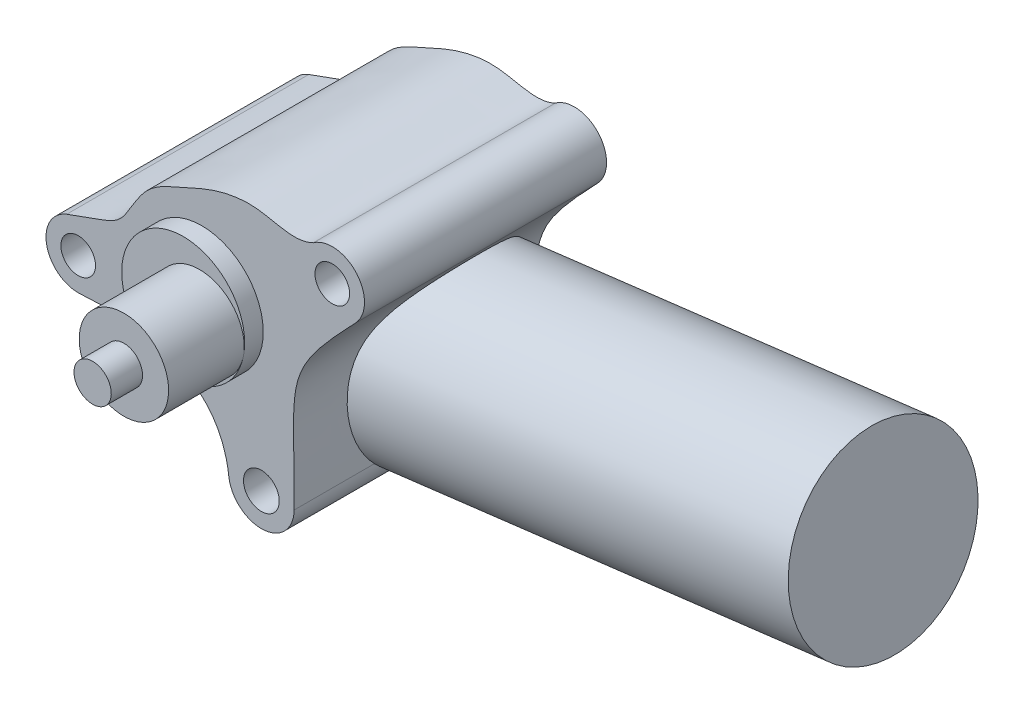
ISO-10303-21;
HEADER;
FILE_DESCRIPTION(('STEP AP214'),'2;1');
FILE_NAME('part.step','',(''),(''),'','','');
FILE_SCHEMA(('AUTOMOTIVE_DESIGN { 1 0 10303 214 1 1 1 1 }'));
ENDSEC;
DATA;
#1=APPLICATION_CONTEXT('core data for automotive mechanical design processes');
#2=APPLICATION_PROTOCOL_DEFINITION('international standard','automotive_design',2000,#1);
#3=PRODUCT_CONTEXT('',#1,'mechanical');
#4=PRODUCT('Part','Part','',(#3));
#5=PRODUCT_RELATED_PRODUCT_CATEGORY('part','',(#4));
#6=PRODUCT_DEFINITION_FORMATION('','',#4);
#7=PRODUCT_DEFINITION_CONTEXT('part definition',#1,'design');
#8=PRODUCT_DEFINITION('design','',#6,#7);
#9=PRODUCT_DEFINITION_SHAPE('','',#8);
#10=(LENGTH_UNIT() NAMED_UNIT(*) SI_UNIT(.MILLI.,.METRE.));
#11=(NAMED_UNIT(*) PLANE_ANGLE_UNIT() SI_UNIT($,.RADIAN.));
#12=(NAMED_UNIT(*) SI_UNIT($,.STERADIAN.) SOLID_ANGLE_UNIT());
#13=UNCERTAINTY_MEASURE_WITH_UNIT(LENGTH_MEASURE(1.E-05),#10,'distance_accuracy_value','');
#14=(GEOMETRIC_REPRESENTATION_CONTEXT(3) GLOBAL_UNCERTAINTY_ASSIGNED_CONTEXT((#13)) GLOBAL_UNIT_ASSIGNED_CONTEXT((#10,
#11,#12)) REPRESENTATION_CONTEXT('',''));
#15=CARTESIAN_POINT('',(0.,0.,0.));
#16=DIRECTION('',(0.,0.,1.));
#17=DIRECTION('',(1.,0.,0.));
#18=AXIS2_PLACEMENT_3D('',#15,#16,#17);
#19=CARTESIAN_POINT('',(36.8927467761636,15.5124618841548,-98.7));
#20=CARTESIAN_POINT('',(16.6600039113231,-5.58266734068858,-98.7));
#21=CARTESIAN_POINT('',(20.638424671102,-4.78611149017639,-98.7));
#22=CARTESIAN_POINT('',(20.4097673928812,-36.2339830538915,-98.7));
#23=B_SPLINE_CURVE_WITH_KNOTS('',3,(#19,#20,#21,#22),.UNSPECIFIED.,.F.,.F.,(4,4),(0.,1.),.UNSPECIFIED.);
#24=DIRECTION('',(0.,0.,1.));
#25=VECTOR('',#24,1.);
#26=SURFACE_OF_LINEAR_EXTRUSION('',#23,#25);
#27=DIRECTION('',(0.,0.,1.));
#28=VECTOR('',#27,1.);
#29=CARTESIAN_POINT('',(20.4097673928812,-36.2339830538915,-98.7));
#30=LINE('',#29,#28);
#31=CARTESIAN_POINT('',(20.4097673928812,-36.2339830538915,-55.2598775282627));
#32=VERTEX_POINT('',#31);
#33=CARTESIAN_POINT('',(20.4097673928812,-36.2339830538915,-33.7));
#34=VERTEX_POINT('',#33);
#35=EDGE_CURVE('E284',#32,#34,#30,.T.);
#36=ORIENTED_EDGE('',*,*,#35,.F.);
#37=CARTESIAN_POINT('',(20.4097673928812,-36.2339830538915,-91.5401224717374));
#38=CARTESIAN_POINT('',(20.4122782032927,-35.8890900930169,-91.8726525588163));
#39=CARTESIAN_POINT('',(20.4143735684972,-35.5348051488267,-92.195439284415));
#40=CARTESIAN_POINT('',(20.4175981856923,-34.8086587689635,-92.8205564126126));
#41=CARTESIAN_POINT('',(20.4187274966766,-34.4367984080266,-93.1228880632965));
#42=CARTESIAN_POINT('',(20.4198851110767,-33.676673631145,-93.7061606290962));
#43=CARTESIAN_POINT('',(20.4199134358619,-33.2884095337342,-93.9871019592807));
#44=CARTESIAN_POINT('',(20.4187637534627,-32.4970970859259,-94.5264715956285));
#45=CARTESIAN_POINT('',(20.4175869034332,-32.0940632746788,-94.7849212390271));
#46=CARTESIAN_POINT('',(20.4139540375388,-31.2741334270694,-95.2788057818276));
#47=CARTESIAN_POINT('',(20.4114980306098,-30.8572374875634,-95.5142408419902));
#48=CARTESIAN_POINT('',(20.4052784497805,-30.0109367907762,-95.9613493001053));
#49=CARTESIAN_POINT('',(20.4015148813767,-29.5815320860845,-96.1730227979383));
#50=CARTESIAN_POINT('',(20.3904914227644,-28.4937390567456,-96.6718104886612));
#51=CARTESIAN_POINT('',(20.3824243713791,-27.8282904272445,-96.9436720652541));
#52=CARTESIAN_POINT('',(20.3637690789437,-26.4769650156284,-97.4304223417962));
#53=CARTESIAN_POINT('',(20.3531808185895,-25.7910880771344,-97.645310605489));
#54=CARTESIAN_POINT('',(20.3303771030497,-24.4036979378516,-98.0166050135038));
#55=CARTESIAN_POINT('',(20.3181616215841,-23.7021844846805,-98.1730102131504));
#56=CARTESIAN_POINT('',(20.2936740456797,-22.2884206736516,-98.426198012403));
#57=CARTESIAN_POINT('',(20.2814019513742,-21.5761703410758,-98.5229807523793));
#58=CARTESIAN_POINT('',(20.2630168751475,-20.3839725114951,-98.6340980542445));
#59=CARTESIAN_POINT('',(20.256212727729,-19.9055259550187,-98.6651465417177));
#60=CARTESIAN_POINT('',(20.2447769272303,-18.9475866100655,-98.7003338258164));
#61=CARTESIAN_POINT('',(20.2401452827138,-18.468093817472,-98.7044725163686));
#62=CARTESIAN_POINT('',(20.2343818774567,-17.5096081016235,-98.6858718647134));
#63=CARTESIAN_POINT('',(20.23325016136,-17.0306151848227,-98.6631321796588));
#64=CARTESIAN_POINT('',(20.2361425432356,-16.0745988647804,-98.5909374599494));
#65=CARTESIAN_POINT('',(20.2401672536494,-15.597575702243,-98.5414792522734));
#66=CARTESIAN_POINT('',(20.2553757245711,-14.647121124051,-98.4161595105112));
#67=CARTESIAN_POINT('',(20.2665594462383,-14.1736896889239,-98.340298119674));
#68=CARTESIAN_POINT('',(20.298429059616,-13.2319974295761,-98.1626616416156));
#69=CARTESIAN_POINT('',(20.3191154697076,-12.76373688886,-98.0608851408342));
#70=CARTESIAN_POINT('',(20.3723763650052,-11.838095287501,-97.8331233207027));
#71=CARTESIAN_POINT('',(20.4048470754617,-11.3806552941861,-97.7073537401375));
#72=CARTESIAN_POINT('',(20.4843594626447,-10.4742869515076,-97.4320252018066));
#73=CARTESIAN_POINT('',(20.5314003428839,-10.0253581382982,-97.2824675446486));
#74=CARTESIAN_POINT('',(20.6425629574371,-9.13783980679959,-96.9608431063166));
#75=CARTESIAN_POINT('',(20.7066825779813,-8.69924901632021,-96.7887791120055));
#76=CARTESIAN_POINT('',(20.8538499684249,-7.83515580930963,-96.4241170931471));
#77=CARTESIAN_POINT('',(20.9368534950041,-7.40962539710582,-96.2315676169084));
#78=CARTESIAN_POINT('',(21.1230188578308,-6.57220746491049,-95.8273664992486));
#79=CARTESIAN_POINT('',(21.2261828811671,-6.16032143078883,-95.6157127866677));
#80=CARTESIAN_POINT('',(21.4526501038546,-5.3516519981118,-95.1752017927925));
#81=CARTESIAN_POINT('',(21.5759510295124,-4.95486690071247,-94.9463464553371));
#82=CARTESIAN_POINT('',(21.855416534107,-4.13662992638358,-94.4483985696733));
#83=CARTESIAN_POINT('',(22.0136685451179,-3.7169305516372,-94.1776000243718));
#84=CARTESIAN_POINT('',(22.3504084579951,-2.89743885964097,-93.6188539705215));
#85=CARTESIAN_POINT('',(22.5289020652869,-2.49765220104511,-93.3309016378077));
#86=CARTESIAN_POINT('',(22.9022061175026,-1.71795717889758,-92.7390352869209));
#87=CARTESIAN_POINT('',(23.0970193937645,-1.33805228333275,-92.4351185024626));
#88=CARTESIAN_POINT('',(23.4998384450558,-0.595579745037544,-91.8100270841471));
#89=CARTESIAN_POINT('',(23.7079157425392,-0.233128555742194,-91.4887606208875));
#90=CARTESIAN_POINT('',(24.1318065731741,0.472406815215855,-90.8306735097549));
#91=CARTESIAN_POINT('',(24.3476184170631,0.815495184172389,-90.4938562536737));
#92=CARTESIAN_POINT('',(24.7828923476535,1.48272996084407,-89.8041451965193));
#93=CARTESIAN_POINT('',(25.0023546483453,1.80687525304993,-89.4512504508572));
#94=CARTESIAN_POINT('',(25.3924823745614,2.36653966286751,-88.8087115705973));
#95=CARTESIAN_POINT('',(25.5632005239949,2.60579926532332,-88.5223490685314));
#96=CARTESIAN_POINT('',(25.9027538064257,3.07264110687054,-87.9391385844624));
#97=CARTESIAN_POINT('',(26.0715888473597,3.30022277698102,-87.6422900927406));
#98=CARTESIAN_POINT('',(26.4057122024546,3.74340544521128,-87.0377323350018));
#99=CARTESIAN_POINT('',(26.5709999886279,3.95900466730402,-86.7300214699678));
#100=CARTESIAN_POINT('',(26.8963561433183,4.3776811186924,-86.1035195356724));
#101=CARTESIAN_POINT('',(27.0564239173602,4.5807569241029,-85.7847272128931));
#102=CARTESIAN_POINT('',(27.5246767796621,5.16814969004756,-84.8148044232095));
#103=CARTESIAN_POINT('',(27.8228499476911,5.53316740827136,-84.1466927033376));
#104=CARTESIAN_POINT('',(28.2399664870055,6.03618788127514,-83.1114595661881));
#105=CARTESIAN_POINT('',(28.3739506526941,6.1964079376998,-82.7609660124975));
#106=CARTESIAN_POINT('',(28.6304298712302,6.50111958362609,-82.0489557408312));
#107=CARTESIAN_POINT('',(28.7529226121217,6.64560800902101,-81.6874368239701));
#108=CARTESIAN_POINT('',(29.0123987372127,6.95006616360994,-80.8666388572246));
#109=CARTESIAN_POINT('',(29.1458944288215,7.1055384893914,-80.4045673587753));
#110=CARTESIAN_POINT('',(29.3898807128791,7.3883175674663,-79.4660755468392));
#111=CARTESIAN_POINT('',(29.5003786806282,7.51563335030016,-78.9896598897584));
#112=CARTESIAN_POINT('',(29.6957939668795,7.74001735165877,-78.0246234476825));
#113=CARTESIAN_POINT('',(29.7807149139685,7.83708986083446,-77.5360044046313));
#114=CARTESIAN_POINT('',(29.9228022517056,7.99915476240474,-76.5494404025887));
#115=CARTESIAN_POINT('',(29.979968136284,8.06414656985892,-76.0514952737229));
#116=CARTESIAN_POINT('',(30.0651669932199,8.16091022967609,-75.0474520392367));
#117=CARTESIAN_POINT('',(30.0930588056401,8.19252112330573,-74.5413262714318));
#118=CARTESIAN_POINT('',(30.1184102980067,8.2212556158288,-73.5273286495953));
#119=CARTESIAN_POINT('',(30.1158701006259,8.21837935374144,-73.0194568026104));
#120=CARTESIAN_POINT('',(30.0804306786243,8.17820338993961,-72.0060690740898));
#121=CARTESIAN_POINT('',(30.0475262895638,8.14089783237916,-71.5005536080355));
#122=CARTESIAN_POINT('',(29.9523019280032,8.03268802323972,-70.4959633667083));
#123=CARTESIAN_POINT('',(29.8899821941494,7.96178404424413,-69.9968885392164));
#124=CARTESIAN_POINT('',(29.7422620445465,7.79312975293811,-69.0385918882538));
#125=CARTESIAN_POINT('',(29.6584836594022,7.69726032821297,-68.5787840522927));
#126=CARTESIAN_POINT('',(29.4684027989161,7.47879558799685,-67.6703845400851));
#127=CARTESIAN_POINT('',(29.3621018025225,7.35620202733207,-67.2217921295384));
#128=CARTESIAN_POINT('',(29.1292222815571,7.08611853407544,-66.3377082431739));
#129=CARTESIAN_POINT('',(29.0026475708253,6.93863328376563,-65.9022143215672));
#130=CARTESIAN_POINT('',(28.7316055571507,6.62058665866853,-65.0454362233258));
#131=CARTESIAN_POINT('',(28.5871357072108,6.45002199869232,-64.6241540803209));
#132=CARTESIAN_POINT('',(28.2757923041399,6.07924189604596,-63.7774898990265));
#133=CARTESIAN_POINT('',(28.1081920916332,5.87802069248061,-63.3528175336341));
#134=CARTESIAN_POINT('',(27.7589943586775,5.45404693834925,-62.5200955282668));
#135=CARTESIAN_POINT('',(27.5773904412029,5.23128453561314,-62.1120536168982));
#136=CARTESIAN_POINT('',(27.2031304994482,4.76584289697073,-61.312694627001));
#137=CARTESIAN_POINT('',(27.0104727317649,4.52316051669005,-60.9213802037944));
#138=CARTESIAN_POINT('',(26.6161648983705,4.01803390806048,-60.1535066151045));
#139=CARTESIAN_POINT('',(26.4144784724425,3.7555061590931,-59.7770212598945));
#140=CARTESIAN_POINT('',(26.0059524735433,3.21261869479892,-59.0402226089177));
#141=CARTESIAN_POINT('',(25.7991139808915,2.93226269898499,-58.679905966449));
#142=CARTESIAN_POINT('',(25.3833118749294,2.35420733610064,-57.9747303247));
#143=CARTESIAN_POINT('',(25.1743481522963,2.05650707306984,-57.6298721255944));
#144=CARTESIAN_POINT('',(24.7468631155891,1.42830285352192,-56.9377456278886));
#145=CARTESIAN_POINT('',(24.5283999534087,1.09689980735216,-56.5912571643449));
#146=CARTESIAN_POINT('',(24.0966863120323,0.415045319779208,-55.9141225137316));
#147=CARTESIAN_POINT('',(23.8834358336683,0.0645938753359891,-55.5834763291904));
#148=CARTESIAN_POINT('',(23.4663344764749,-0.655843273826237,-54.9376505762566));
#149=CARTESIAN_POINT('',(23.2624858199053,-1.02583355295838,-54.6224746633723));
#150=CARTESIAN_POINT('',(22.8696826852168,-1.78374418041937,-54.009465811313));
#151=CARTESIAN_POINT('',(22.6806547983762,-2.17155877036686,-53.7115495925079));
#152=CARTESIAN_POINT('',(22.3205414669644,-2.96716267278731,-53.1320810549652));
#153=CARTESIAN_POINT('',(22.1494524767004,-3.37494801449808,-52.8505255074003));
#154=CARTESIAN_POINT('',(21.8288680233002,-4.21028238157137,-52.3052611120887));
#155=CARTESIAN_POINT('',(21.6793637896171,-4.63782328589678,-52.0415450388983));
#156=CARTESIAN_POINT('',(21.4288692220625,-5.43391490507005,-51.5792433039907));
#157=CARTESIAN_POINT('',(21.3239826712178,-5.7993734764026,-51.3774342892728));
#158=CARTESIAN_POINT('',(21.130887366569,-6.542368816786,-50.9885016382849));
#159=CARTESIAN_POINT('',(21.042679788462,-6.91990643509475,-50.8013790378004));
#160=CARTESIAN_POINT('',(20.8827028507778,-7.68590507376394,-50.443235760054));
#161=CARTESIAN_POINT('',(20.8109323588869,-8.07436533961688,-50.272213974122));
#162=CARTESIAN_POINT('',(20.68270105028,-8.86170807923196,-49.9472541631739));
#163=CARTESIAN_POINT('',(20.6262693191061,-9.26060880234757,-49.7933489166242));
#164=CARTESIAN_POINT('',(20.5273347641974,-10.0668075112904,-49.5041292391227));
#165=CARTESIAN_POINT('',(20.4848329224378,-10.4741060869664,-49.3688161191967));
#166=CARTESIAN_POINT('',(20.4118831669342,-11.2957439462009,-49.1177308510898));
#167=CARTESIAN_POINT('',(20.3814355757909,-11.7100834178812,-49.001959225934));
#168=CARTESIAN_POINT('',(20.3307412589108,-12.5423668820644,-48.7912379824711));
#169=CARTESIAN_POINT('',(20.3104432033663,-12.9602816374317,-48.6961849898551));
#170=CARTESIAN_POINT('',(20.2779190924535,-13.8005546577296,-48.5267045722768));
#171=CARTESIAN_POINT('',(20.2656926517664,-14.2229127095703,-48.4522761628469));
#172=CARTESIAN_POINT('',(20.2475714585188,-15.070921745656,-48.3244360804122));
#173=CARTESIAN_POINT('',(20.2416766256622,-15.4965726880724,-48.2710241408866));
#174=CARTESIAN_POINT('',(20.2346886370052,-16.3500215078411,-48.1854893233902));
#175=CARTESIAN_POINT('',(20.2335952521951,-16.7778192818237,-48.1533654301272));
#176=CARTESIAN_POINT('',(20.2349021141757,-17.6344890715372,-48.1105726825435));
#177=CARTESIAN_POINT('',(20.2373023835859,-18.0633610942052,-48.0999039671343));
#178=CARTESIAN_POINT('',(20.2445120032009,-18.9210769676191,-48.1000973760006));
#179=CARTESIAN_POINT('',(20.2493214934558,-19.3499208152776,-48.110960752064));
#180=CARTESIAN_POINT('',(20.2640197992347,-20.4820946872287,-48.1681636418566));
#181=CARTESIAN_POINT('',(20.2751859561716,-21.1845677366,-48.2328264710435));
#182=CARTESIAN_POINT('',(20.2986027335405,-22.5817221937074,-48.4199781640794));
#183=CARTESIAN_POINT('',(20.3108534259269,-23.2764030810168,-48.5424708670323));
#184=CARTESIAN_POINT('',(20.3345252938515,-24.6537570985475,-48.8445436359088));
#185=CARTESIAN_POINT('',(20.3459459159134,-25.336421990977,-49.0241613704804));
#186=CARTESIAN_POINT('',(20.3667672805298,-26.6845653965447,-49.4391993973418));
#187=CARTESIAN_POINT('',(20.3761681040605,-27.3500445977374,-49.6746174517304));
#188=CARTESIAN_POINT('',(20.3924947729841,-28.6725382330218,-50.2049342639715));
#189=CARTESIAN_POINT('',(20.3993668243512,-29.3291105878832,-50.5009378340598));
#190=CARTESIAN_POINT('',(20.4101417009327,-30.6151202762685,-51.1472844591308));
#191=CARTESIAN_POINT('',(20.4140439938664,-31.2445527263454,-51.4976372417818));
#192=CARTESIAN_POINT('',(20.4189607574419,-32.4704283536752,-52.2494002571822));
#193=CARTESIAN_POINT('',(20.4199808513035,-33.0669335389213,-52.6507094715014));
#194=CARTESIAN_POINT('',(20.4194471225571,-34.2237635490652,-53.5019597928883));
#195=CARTESIAN_POINT('',(20.41789492741,-34.7841110175702,-53.951869982283));
#196=CARTESIAN_POINT('',(20.4145258018651,-35.4793573675483,-54.5600367891104));
#197=CARTESIAN_POINT('',(20.4136867081798,-35.6327389273694,-54.6975230574035));
#198=CARTESIAN_POINT('',(20.4118459525325,-35.9359768176279,-54.9760323913943));
#199=CARTESIAN_POINT('',(20.4108444517574,-36.0858364763723,-55.1170518343172));
#200=CARTESIAN_POINT('',(20.4097673928812,-36.2339830538915,-55.2598775282627));
#201=B_SPLINE_CURVE_WITH_KNOTS('',3,(#37,#38,#39,#40,#41,#42,#43,#44,#45,#46,#47,#48,#49,#50,
#51,#52,#53,#54,#55,#56,#57,#58,#59,#60,#61,#62,#63,#64,#65,#66,#67,#68,#69,#70,#71,#72,#73,#74,
#75,#76,#77,#78,#79,#80,#81,#82,#83,#84,#85,#86,#87,#88,#89,#90,#91,#92,#93,#94,#95,#96,#97,#98,
#99,#100,#101,#102,#103,#104,#105,#106,#107,#108,#109,#110,#111,#112,#113,#114,#115,#116,#117,
#118,#119,#120,#121,#122,#123,#124,#125,#126,#127,#128,#129,#130,#131,#132,#133,#134,#135,#136,
#137,#138,#139,#140,#141,#142,#143,#144,#145,#146,#147,#148,#149,#150,#151,#152,#153,#154,#155,
#156,#157,#158,#159,#160,#161,#162,#163,#164,#165,#166,#167,#168,#169,#170,#171,#172,#173,#174,
#175,#176,#177,#178,#179,#180,#181,#182,#183,#184,#185,#186,#187,#188,#189,#190,#191,#192,#193,
#194,#195,#196,#197,#198,#199,#200),.UNSPECIFIED.,.F.,.F.,(4,2,2,2,2,2,2,2,2,2,2,2,2,2,2,2,2,2,
2,2,2,2,2,2,2,2,2,2,2,2,2,2,2,2,2,2,2,2,2,2,2,2,2,2,2,2,2,2,2,2,2,2,2,2,2,2,2,2,2,2,2,2,2,2,2,2,
2,2,2,2,2,2,2,2,2,2,2,2,2,2,2,4),(0.,1.4370945807749,2.87410139667667,4.31108032104593,
5.74668081500338,7.18227128034712,8.61785571104682,10.7718072473784,12.9257752764843,
15.0797780970756,17.2337758464353,18.67158802,20.1094058611409,21.5472420425665,
22.9852490151684,24.4232481860622,25.8613258105627,27.2870351057826,28.7126664774596,
30.1381214861634,31.5602705591004,32.9825739980198,34.4047169530267,35.9754051885835,
37.5465372539452,39.1179424654955,40.6986865515804,42.2790874746088,43.859581369817,
45.0903726011434,46.3212237431695,47.5522568368929,48.7834296393153,51.231752055511,
52.4552794435838,53.6790524671761,55.1940272370343,56.708515407889,58.2227886184744,
59.7370894383956,61.2586591500287,62.7802227281509,64.3020451464327,65.8238552184076,
67.2537178810357,68.6834866807583,70.1129868311986,71.5426906752351,73.0384421814626,
74.5348810557209,76.0315565992366,77.5349251895473,79.037981154114,80.5411148316597,
82.1211727208534,83.7012308622162,85.2816605795574,86.8536897256221,88.425407565927,
89.9964849608769,91.2871338130311,92.5778736088569,93.8685244617897,95.1616058544949,
96.4547783822237,97.7479855160232,99.0345845658842,100.321122192284,101.607643502917,
102.894103451,104.180571728245,105.467114797701,107.581121094425,109.695267751672,
111.810811392676,113.926270203042,116.084434273813,118.242985069202,120.397321577258,
122.550295579069,123.168205560347,123.785505985612),.UNSPECIFIED.);
#202=CARTESIAN_POINT('',(20.240857966865,-18.4863517742807,-98.7));
#203=VERTEX_POINT('',#202);
#204=EDGE_CURVE('E64',#203,#32,#201,.T.);
#205=ORIENTED_EDGE('',*,*,#204,.F.);
#206=CARTESIAN_POINT('',(36.8927467761636,15.5124618841548,-98.7));
#207=VERTEX_POINT('',#206);
#208=EDGE_CURVE('E120',#207,#203,#23,.T.);
#209=ORIENTED_EDGE('',*,*,#208,.F.);
#210=DIRECTION('',(0.,0.,1.));
#211=VECTOR('',#210,1.);
#212=CARTESIAN_POINT('',(36.8927467761636,15.5124618841548,-98.7));
#213=LINE('',#212,#211);
#214=CARTESIAN_POINT('',(36.8927467761636,15.5124618841548,-33.7));
#215=VERTEX_POINT('',#214);
#216=EDGE_CURVE('E129',#207,#215,#213,.T.);
#217=ORIENTED_EDGE('',*,*,#216,.T.);
#218=CARTESIAN_POINT('',(36.8927467761636,15.5124618841548,-33.7));
#219=CARTESIAN_POINT('',(16.6600039113231,-5.58266734068858,-33.7));
#220=CARTESIAN_POINT('',(20.638424671102,-4.78611149017639,-33.7));
#221=CARTESIAN_POINT('',(20.4097673928812,-36.2339830538915,-33.7));
#222=B_SPLINE_CURVE_WITH_KNOTS('',3,(#218,#219,#220,#221),.UNSPECIFIED.,.F.,.F.,(4,4),(0.,1.),.UNSPECIFIED.);
#223=EDGE_CURVE('E266',#215,#34,#222,.T.);
#224=ORIENTED_EDGE('',*,*,#223,.T.);
#225=EDGE_LOOP('',(#36,#205,#209,#217,#224));
#226=FACE_BOUND('',#225,.T.);
#227=ADVANCED_FACE('F48',(#226),#26,.F.);
#228=CARTESIAN_POINT('',(-36.9554305577612,-14.6921744351608,-98.7));
#229=CARTESIAN_POINT('',(-22.1953979813566,-13.623643748957,-98.7));
#230=CARTESIAN_POINT('',(0.238034162713776,-15.065738179691,-98.7));
#231=CARTESIAN_POINT('',(2.87158349527631,-37.2092675256991,-98.7));
#232=B_SPLINE_CURVE_WITH_KNOTS('',3,(#228,#229,#230,#231),.UNSPECIFIED.,.F.,.F.,(4,4),(0.,1.),.UNSPECIFIED.);
#233=DIRECTION('',(0.,0.,1.));
#234=VECTOR('',#233,1.);
#235=SURFACE_OF_LINEAR_EXTRUSION('',#232,#234);
#236=CARTESIAN_POINT('',(-36.9554305577612,-14.6921744351608,-33.7));
#237=CARTESIAN_POINT('',(-22.1953979813566,-13.623643748957,-33.7));
#238=CARTESIAN_POINT('',(0.238034162713776,-15.065738179691,-33.7));
#239=CARTESIAN_POINT('',(2.87158349527631,-37.2092675256991,-33.7));
#240=B_SPLINE_CURVE_WITH_KNOTS('',3,(#236,#237,#238,#239),.UNSPECIFIED.,.F.,.F.,(4,4),(0.,1.),.UNSPECIFIED.);
#241=CARTESIAN_POINT('',(-36.9554305577612,-14.6921744351608,-33.7));
#242=VERTEX_POINT('',#241);
#243=CARTESIAN_POINT('',(2.87158349527632,-37.2092675256991,-33.7));
#244=VERTEX_POINT('',#243);
#245=EDGE_CURVE('E187',#242,#244,#240,.T.);
#246=ORIENTED_EDGE('',*,*,#245,.F.);
#247=DIRECTION('',(0.,0.,1.));
#248=VECTOR('',#247,1.);
#249=CARTESIAN_POINT('',(-36.9554305577612,-14.6921744351608,-98.7));
#250=LINE('',#249,#248);
#251=CARTESIAN_POINT('',(-36.9554305577612,-14.6921744351608,-98.7));
#252=VERTEX_POINT('',#251);
#253=EDGE_CURVE('E12',#252,#242,#250,.T.);
#254=ORIENTED_EDGE('',*,*,#253,.F.);
#255=CARTESIAN_POINT('',(2.87158349527632,-37.2092675256991,-98.7));
#256=VERTEX_POINT('',#255);
#257=EDGE_CURVE('E175',#252,#256,#232,.T.);
#258=ORIENTED_EDGE('',*,*,#257,.T.);
#259=DIRECTION('',(0.,0.,1.));
#260=VECTOR('',#259,1.);
#261=CARTESIAN_POINT('',(2.87158349527632,-37.2092675256991,-98.7));
#262=LINE('',#261,#260);
#263=EDGE_CURVE('E99',#256,#244,#262,.T.);
#264=ORIENTED_EDGE('',*,*,#263,.T.);
#265=EDGE_LOOP('',(#246,#254,#258,#264));
#266=FACE_BOUND('',#265,.T.);
#267=ADVANCED_FACE('F50',(#266),#235,.T.);
#268=CARTESIAN_POINT('',(-37.58,-6.06475228182779,-98.7));
#269=DIRECTION('',(0.,0.,1.));
#270=DIRECTION('',(0.,-1.,0.));
#271=AXIS2_PLACEMENT_3D('',#268,#269,#270);
#272=CYLINDRICAL_SURFACE('',#271,8.65000000000001);
#273=CARTESIAN_POINT('',(-37.58,-6.06475228182779,-33.7));
#274=DIRECTION('',(0.,0.,-1.));
#275=DIRECTION('',(-1.,0.,0.));
#276=AXIS2_PLACEMENT_3D('',#273,#274,#275);
#277=CIRCLE('',#276,8.65000000000001);
#278=CARTESIAN_POINT('',(-40.6647586805377,2.01650776118825,-33.7));
#279=VERTEX_POINT('',#278);
#280=EDGE_CURVE('E246',#242,#279,#277,.T.);
#281=ORIENTED_EDGE('',*,*,#280,.T.);
#282=DIRECTION('',(0.,0.,1.));
#283=VECTOR('',#282,1.);
#284=CARTESIAN_POINT('',(-40.6647586805377,2.01650776118824,-98.7));
#285=LINE('',#284,#283);
#286=CARTESIAN_POINT('',(-40.6647586805377,2.01650776118824,-98.7));
#287=VERTEX_POINT('',#286);
#288=EDGE_CURVE('E57',#287,#279,#285,.T.);
#289=ORIENTED_EDGE('',*,*,#288,.F.);
#290=CARTESIAN_POINT('',(-37.58,-6.06475228182779,-98.7));
#291=DIRECTION('',(0.,0.,-1.));
#292=DIRECTION('',(-1.,0.,0.));
#293=AXIS2_PLACEMENT_3D('',#290,#291,#292);
#294=CIRCLE('',#293,8.65000000000001);
#295=EDGE_CURVE('E171',#252,#287,#294,.T.);
#296=ORIENTED_EDGE('',*,*,#295,.F.);
#297=ORIENTED_EDGE('',*,*,#253,.T.);
#298=EDGE_LOOP('',(#281,#289,#296,#297));
#299=FACE_BOUND('',#298,.T.);
#300=ADVANCED_FACE('F165',(#299),#272,.T.);
#301=CARTESIAN_POINT('',(-40.6647586805377,2.01650776118824,-98.7));
#302=CARTESIAN_POINT('',(-29.8089565823538,6.1603578016918,-98.7));
#303=CARTESIAN_POINT('',(-26.3224765804781,5.89019841866121,-98.7));
#304=CARTESIAN_POINT('',(-19.6421629704237,19.8060437389043,-98.7));
#305=CARTESIAN_POINT('',(-11.0597976347966,22.9914736554906,-98.7));
#306=CARTESIAN_POINT('',(-1.66890297427807,27.5301328967702,-98.7));
#307=CARTESIAN_POINT('',(10.6116087423487,30.6642659950631,-98.7));
#308=CARTESIAN_POINT('',(20.537859468795,25.9614175810182,-98.7));
#309=CARTESIAN_POINT('',(25.5482455238102,28.4853132545847,-98.7));
#310=B_SPLINE_CURVE_WITH_KNOTS('',3,(#301,#302,#303,#304,#305,#306,#307,#308,#309),
.UNSPECIFIED.,.F.,.F.,(4,1,1,1,1,1,4),(0.,0.235357900246048,0.37396137290499,0.518248086756962,
0.593954255967096,0.794427618619775,1.),.UNSPECIFIED.);
#311=DIRECTION('',(0.,0.,1.));
#312=VECTOR('',#311,1.);
#313=SURFACE_OF_LINEAR_EXTRUSION('',#310,#312);
#314=CARTESIAN_POINT('',(-40.6647586805377,2.01650776118824,-33.7));
#315=CARTESIAN_POINT('',(-29.8089565823538,6.1603578016918,-33.7));
#316=CARTESIAN_POINT('',(-26.3224765804781,5.89019841866121,-33.7));
#317=CARTESIAN_POINT('',(-19.6421629704237,19.8060437389043,-33.7));
#318=CARTESIAN_POINT('',(-11.0597976347966,22.9914736554906,-33.7));
#319=CARTESIAN_POINT('',(-1.66890297427807,27.5301328967702,-33.7));
#320=CARTESIAN_POINT('',(10.6116087423487,30.6642659950631,-33.7));
#321=CARTESIAN_POINT('',(20.537859468795,25.9614175810182,-33.7));
#322=CARTESIAN_POINT('',(25.5482455238102,28.4853132545847,-33.7));
#323=B_SPLINE_CURVE_WITH_KNOTS('',3,(#314,#315,#316,#317,#318,#319,#320,#321,#322),
.UNSPECIFIED.,.F.,.F.,(4,1,1,1,1,1,4),(0.,0.235357900246048,0.37396137290499,0.518248086756962,
0.593954255967096,0.794427618619775,1.),.UNSPECIFIED.);
#324=CARTESIAN_POINT('',(25.5482455238102,28.4853132545847,-33.7));
#325=VERTEX_POINT('',#324);
#326=EDGE_CURVE('E248',#279,#325,#323,.T.);
#327=ORIENTED_EDGE('',*,*,#326,.T.);
#328=DIRECTION('',(0.,0.,1.));
#329=VECTOR('',#328,1.);
#330=CARTESIAN_POINT('',(25.5482455238102,28.4853132545847,-98.7));
#331=LINE('',#330,#329);
#332=CARTESIAN_POINT('',(25.5482455238102,28.4853132545847,-98.7));
#333=VERTEX_POINT('',#332);
#334=EDGE_CURVE('E136',#333,#325,#331,.T.);
#335=ORIENTED_EDGE('',*,*,#334,.F.);
#336=EDGE_CURVE('E122',#287,#333,#310,.T.);
#337=ORIENTED_EDGE('',*,*,#336,.F.);
#338=ORIENTED_EDGE('',*,*,#288,.T.);
#339=EDGE_LOOP('',(#327,#335,#337,#338));
#340=FACE_BOUND('',#339,.T.);
#341=ADVANCED_FACE('F163',(#340),#313,.F.);
#342=CARTESIAN_POINT('',(30.65,21.5,-98.7));
#343=DIRECTION('',(0.,0.,1.));
#344=DIRECTION('',(0.,-1.,0.));
#345=AXIS2_PLACEMENT_3D('',#342,#343,#344);
#346=CYLINDRICAL_SURFACE('',#345,8.65);
#347=CARTESIAN_POINT('',(30.65,21.5,-33.7));
#348=DIRECTION('',(0.,0.,-1.));
#349=DIRECTION('',(-1.,0.,0.));
#350=AXIS2_PLACEMENT_3D('',#347,#348,#349);
#351=CIRCLE('',#350,8.65);
#352=EDGE_CURVE('E132',#325,#215,#351,.T.);
#353=ORIENTED_EDGE('',*,*,#352,.T.);
#354=ORIENTED_EDGE('',*,*,#216,.F.);
#355=CARTESIAN_POINT('',(30.65,21.5,-98.7));
#356=DIRECTION('',(0.,0.,-1.));
#357=DIRECTION('',(-1.,0.,0.));
#358=AXIS2_PLACEMENT_3D('',#355,#356,#357);
#359=CIRCLE('',#358,8.65);
#360=EDGE_CURVE('E115',#333,#207,#359,.T.);
#361=ORIENTED_EDGE('',*,*,#360,.F.);
#362=ORIENTED_EDGE('',*,*,#334,.T.);
#363=EDGE_LOOP('',(#353,#354,#361,#362));
#364=FACE_BOUND('',#363,.T.);
#365=ADVANCED_FACE('F130',(#364),#346,.T.);
#366=CARTESIAN_POINT('',(20.4097673928812,-36.2339830538915,-98.7));
#367=VERTEX_POINT('',#366);
#368=EDGE_CURVE('E126',#203,#367,#23,.T.);
#369=ORIENTED_EDGE('',*,*,#368,.F.);
#370=CARTESIAN_POINT('',(20.4097673928812,-36.2339830538915,-91.5401224717374));
#371=VERTEX_POINT('',#370);
#372=EDGE_CURVE('E197',#371,#203,#201,.T.);
#373=ORIENTED_EDGE('',*,*,#372,.F.);
#374=EDGE_CURVE('E137',#367,#371,#30,.T.);
#375=ORIENTED_EDGE('',*,*,#374,.F.);
#376=EDGE_LOOP('',(#369,#373,#375));
#377=FACE_BOUND('',#376,.T.);
#378=ADVANCED_FACE('F153',(#377),#26,.F.);
#379=CARTESIAN_POINT('',(30.65,21.5,-98.7));
#380=DIRECTION('',(0.,0.,1.));
#381=DIRECTION('',(0.,-1.,0.));
#382=AXIS2_PLACEMENT_3D('',#379,#380,#381);
#383=CYLINDRICAL_SURFACE('',#382,4.65);
#384=CARTESIAN_POINT('',(30.65,21.5,-98.7));
#385=DIRECTION('',(0.,0.,-1.));
#386=DIRECTION('',(-1.,0.,0.));
#387=AXIS2_PLACEMENT_3D('',#384,#385,#386);
#388=CIRCLE('',#387,4.65);
#389=CARTESIAN_POINT('',(26.,21.5,-98.7));
#390=VERTEX_POINT('',#389);
#391=EDGE_CURVE('E323',#390,#390,#388,.T.);
#392=ORIENTED_EDGE('',*,*,#391,.T.);
#393=EDGE_LOOP('',(#392));
#394=FACE_BOUND('',#393,.T.);
#395=CARTESIAN_POINT('',(30.65,21.5,-33.7));
#396=DIRECTION('',(0.,0.,-1.));
#397=DIRECTION('',(-1.,0.,0.));
#398=AXIS2_PLACEMENT_3D('',#395,#396,#397);
#399=CIRCLE('',#398,4.65);
#400=CARTESIAN_POINT('',(26.,21.5,-33.7));
#401=VERTEX_POINT('',#400);
#402=EDGE_CURVE('E278',#401,#401,#399,.T.);
#403=ORIENTED_EDGE('',*,*,#402,.F.);
#404=EDGE_LOOP('',(#403));
#405=FACE_BOUND('',#404,.T.);
#406=ADVANCED_FACE('F157',(#394,#405),#383,.F.);
#407=CARTESIAN_POINT('',(11.61,-36.17,-98.7));
#408=DIRECTION('',(0.,0.,1.));
#409=DIRECTION('',(0.,-1.,0.));
#410=AXIS2_PLACEMENT_3D('',#407,#408,#409);
#411=CYLINDRICAL_SURFACE('',#410,4.8);
#412=CARTESIAN_POINT('',(11.61,-36.17,-98.7));
#413=DIRECTION('',(0.,0.,-1.));
#414=DIRECTION('',(-1.,0.,0.));
#415=AXIS2_PLACEMENT_3D('',#412,#413,#414);
#416=CIRCLE('',#415,4.8);
#417=CARTESIAN_POINT('',(6.81,-36.17,-98.7));
#418=VERTEX_POINT('',#417);
#419=EDGE_CURVE('E142',#418,#418,#416,.T.);
#420=ORIENTED_EDGE('',*,*,#419,.T.);
#421=EDGE_LOOP('',(#420));
#422=FACE_BOUND('',#421,.T.);
#423=CARTESIAN_POINT('',(11.61,-36.17,-33.7));
#424=DIRECTION('',(0.,0.,-1.));
#425=DIRECTION('',(-1.,0.,0.));
#426=AXIS2_PLACEMENT_3D('',#423,#424,#425);
#427=CIRCLE('',#426,4.8);
#428=CARTESIAN_POINT('',(6.81,-36.17,-33.7));
#429=VERTEX_POINT('',#428);
#430=EDGE_CURVE('E275',#429,#429,#427,.T.);
#431=ORIENTED_EDGE('',*,*,#430,.F.);
#432=EDGE_LOOP('',(#431));
#433=FACE_BOUND('',#432,.T.);
#434=ADVANCED_FACE('F300',(#422,#433),#411,.F.);
#435=CARTESIAN_POINT('',(11.61,-36.17,-98.7));
#436=DIRECTION('',(0.,0.,1.));
#437=DIRECTION('',(0.,-1.,0.));
#438=AXIS2_PLACEMENT_3D('',#435,#436,#437);
#439=CYLINDRICAL_SURFACE('',#438,8.8);
#440=ORIENTED_EDGE('',*,*,#374,.T.);
#441=CARTESIAN_POINT('',(20.4097673928812,-36.2339830538915,-91.5401224717374));
#442=CARTESIAN_POINT('',(20.4084899760757,-36.4087180827429,-91.3716660025776));
#443=CARTESIAN_POINT('',(20.402038260137,-36.5812818043241,-91.2010792612294));
#444=CARTESIAN_POINT('',(20.3794922475607,-36.9217513926349,-90.8560296681663));
#445=CARTESIAN_POINT('',(20.3634006773926,-37.0896585623471,-90.6815679258594));
#446=CARTESIAN_POINT('',(20.3018012434187,-37.5854059439908,-90.1535080990289));
#447=CARTESIAN_POINT('',(20.2429578263085,-37.9059741846096,-89.7945577863056));
#448=CARTESIAN_POINT('',(20.0953481987066,-38.5234762717742,-89.0681318580436));
#449=CARTESIAN_POINT('',(20.0068302107995,-38.8205817098665,-88.7007497725298));
#450=CARTESIAN_POINT('',(19.80395475207,-39.393586689055,-87.9564151126619));
#451=CARTESIAN_POINT('',(19.6895808261046,-39.6694725751693,-87.5794565799011));
#452=CARTESIAN_POINT('',(19.3804179405678,-40.3227265357108,-86.6409126969694));
#453=CARTESIAN_POINT('',(19.1729488613567,-40.6877359538237,-86.0748708353121));
#454=CARTESIAN_POINT('',(18.7200156155703,-41.3715291149858,-84.9303031460153));
#455=CARTESIAN_POINT('',(18.474540539691,-41.6902995344707,-84.3517737751028));
#456=CARTESIAN_POINT('',(17.9518695371182,-42.2837339939716,-83.1825560246532));
#457=CARTESIAN_POINT('',(17.6745273233055,-42.5581794883475,-82.5918226826068));
#458=CARTESIAN_POINT('',(17.0953082210184,-43.0619296567192,-81.4034203878891));
#459=CARTESIAN_POINT('',(16.7934348332362,-43.2912407556387,-80.8057524352115));
#460=CARTESIAN_POINT('',(16.1910965164535,-43.6916607174434,-79.6455368747231));
#461=CARTESIAN_POINT('',(15.8918943745039,-43.8656411898945,-79.0833214902754));
#462=CARTESIAN_POINT('',(15.2801203065373,-44.1754881490942,-77.9558259777115));
#463=CARTESIAN_POINT('',(14.9675474747851,-44.3113520490858,-77.3905456442467));
#464=CARTESIAN_POINT('',(14.0160904251783,-44.6615563908894,-75.6946603392887));
#465=CARTESIAN_POINT('',(13.3615118551426,-44.8197771353433,-74.5603106039174));
#466=CARTESIAN_POINT('',(12.693142912705,-44.9030882501169,-73.4182675307094));
#467=CARTESIAN_POINT('',(12.6877968385163,-44.9037496487061,-73.4091337168464));
#468=CARTESIAN_POINT('',(12.6824502219653,-44.9044061344436,-73.4));
#469=B_SPLINE_CURVE_WITH_KNOTS('',3,(#441,#442,#443,#444,#445,#446,#447,#448,#449,#450,#451,
#452,#453,#454,#455,#456,#457,#458,#459,#460,#461,#462,#463,#464,#465,#466,#467,#468),
.UNSPECIFIED.,.F.,.F.,(4,2,2,2,2,2,2,2,2,2,2,2,2,4),(0.,0.727979259795441,1.45575272012963,
2.90838305329387,4.34915359818173,5.79084366737457,7.90193724678716,10.0136379252875,
12.1354519566486,14.2569637269929,16.2362231776882,18.2156169170913,22.1613598258723,
22.1931717767742),.UNSPECIFIED.);
#470=CARTESIAN_POINT('',(12.6824502219653,-44.9044061344436,-73.4));
#471=VERTEX_POINT('',#470);
#472=EDGE_CURVE('E188',#471,#371,#469,.F.);
#473=ORIENTED_EDGE('',*,*,#472,.F.);
#474=CARTESIAN_POINT('',(20.4097673928812,-36.2339830538915,-55.2598775282627));
#475=CARTESIAN_POINT('',(20.4084899760757,-36.4087180827429,-55.4283339974224));
#476=CARTESIAN_POINT('',(20.402038260137,-36.581281804324,-55.5989207387705));
#477=CARTESIAN_POINT('',(20.3794922475607,-36.9217513926346,-55.9439703318335));
#478=CARTESIAN_POINT('',(20.3634006773926,-37.0896585623468,-56.1184320741403));
#479=CARTESIAN_POINT('',(20.3018012434187,-37.5854059439903,-56.6464919009706));
#480=CARTESIAN_POINT('',(20.2429578263086,-37.905974184609,-57.0054422136938));
#481=CARTESIAN_POINT('',(20.0953481987068,-38.5234762717737,-57.7318681419557));
#482=CARTESIAN_POINT('',(20.0068302107997,-38.8205817098661,-58.0992502274696));
#483=CARTESIAN_POINT('',(19.8039547520701,-39.3935866890548,-58.8435848873378));
#484=CARTESIAN_POINT('',(19.6895808261046,-39.6694725751692,-59.2205434200987));
#485=CARTESIAN_POINT('',(19.3804179405678,-40.3227265357109,-60.1590873030307));
#486=CARTESIAN_POINT('',(19.1729488613566,-40.6877359538238,-60.7251291646881));
#487=CARTESIAN_POINT('',(18.7200156155701,-41.371529114986,-61.8696968539851));
#488=CARTESIAN_POINT('',(18.4745405396909,-41.690299534471,-62.4482262248976));
#489=CARTESIAN_POINT('',(17.951869537118,-42.2837339939718,-63.6174439753472));
#490=CARTESIAN_POINT('',(17.6745273233053,-42.5581794883477,-64.2081773173935));
#491=CARTESIAN_POINT('',(17.0953082210184,-43.0619296567193,-65.3965796121111));
#492=CARTESIAN_POINT('',(16.7934348332364,-43.2912407556387,-65.9942475647887));
#493=CARTESIAN_POINT('',(16.1910965164533,-43.6916607174434,-67.1544631252768));
#494=CARTESIAN_POINT('',(15.8918943745032,-43.8656411898946,-67.7166785097241));
#495=CARTESIAN_POINT('',(15.2801203065381,-44.1754881490941,-68.8441740222889));
#496=CARTESIAN_POINT('',(14.9675474747878,-44.3113520490854,-69.4094543557548));
#497=CARTESIAN_POINT('',(14.0160904251729,-44.6615563908901,-71.105339660708));
#498=CARTESIAN_POINT('',(13.361511855113,-44.8197771353471,-72.239689396065));
#499=CARTESIAN_POINT('',(12.6931429127045,-44.9030882501169,-73.3817324692903));
#500=CARTESIAN_POINT('',(12.687796838516,-44.9037496487062,-73.3908662831534));
#501=CARTESIAN_POINT('',(12.6824502219653,-44.9044061344436,-73.4));
#502=B_SPLINE_CURVE_WITH_KNOTS('',3,(#474,#475,#476,#477,#478,#479,#480,#481,#482,#483,#484,
#485,#486,#487,#488,#489,#490,#491,#492,#493,#494,#495,#496,#497,#498,#499,#500,#501),
.UNSPECIFIED.,.F.,.F.,(4,2,2,2,2,2,2,2,2,2,2,2,2,4),(0.,0.727979259795186,1.45575272012911,
2.90838305329279,4.34915359818117,5.79084366737457,7.90193724678753,10.0136379252881,
12.1354519566489,14.2569637269929,16.2362231776882,18.2156169170911,22.1613598258723,
22.1931717767742),.UNSPECIFIED.);
#503=EDGE_CURVE('E216',#32,#471,#502,.T.);
#504=ORIENTED_EDGE('',*,*,#503,.F.);
#505=ORIENTED_EDGE('',*,*,#35,.T.);
#506=CARTESIAN_POINT('',(11.61,-36.17,-33.7));
#507=DIRECTION('',(0.,0.,-1.));
#508=DIRECTION('',(-1.,0.,0.));
#509=AXIS2_PLACEMENT_3D('',#506,#507,#508);
#510=CIRCLE('',#509,8.8);
#511=EDGE_CURVE('E270',#34,#244,#510,.T.);
#512=ORIENTED_EDGE('',*,*,#511,.T.);
#513=ORIENTED_EDGE('',*,*,#263,.F.);
#514=CARTESIAN_POINT('',(11.61,-36.17,-98.7));
#515=DIRECTION('',(0.,0.,-1.));
#516=DIRECTION('',(-1.,0.,0.));
#517=AXIS2_PLACEMENT_3D('',#514,#515,#516);
#518=CIRCLE('',#517,8.8);
#519=EDGE_CURVE('E73',#367,#256,#518,.T.);
#520=ORIENTED_EDGE('',*,*,#519,.F.);
#521=EDGE_LOOP('',(#440,#473,#504,#505,#512,#513,#520));
#522=FACE_BOUND('',#521,.T.);
#523=ADVANCED_FACE('F159',(#522),#439,.T.);
#524=CARTESIAN_POINT('',(-37.58,-6.06475228182779,-98.7));
#525=DIRECTION('',(0.,0.,1.));
#526=DIRECTION('',(0.,-1.,0.));
#527=AXIS2_PLACEMENT_3D('',#524,#525,#526);
#528=CYLINDRICAL_SURFACE('',#527,4.65);
#529=CARTESIAN_POINT('',(-37.58,-6.06475228182779,-98.7));
#530=DIRECTION('',(0.,0.,-1.));
#531=DIRECTION('',(-1.,0.,0.));
#532=AXIS2_PLACEMENT_3D('',#529,#530,#531);
#533=CIRCLE('',#532,4.65);
#534=CARTESIAN_POINT('',(-42.23,-6.06475228182779,-98.7));
#535=VERTEX_POINT('',#534);
#536=EDGE_CURVE('E253',#535,#535,#533,.T.);
#537=ORIENTED_EDGE('',*,*,#536,.T.);
#538=EDGE_LOOP('',(#537));
#539=FACE_BOUND('',#538,.T.);
#540=CARTESIAN_POINT('',(-37.58,-6.06475228182779,-33.7));
#541=DIRECTION('',(0.,0.,-1.));
#542=DIRECTION('',(-1.,0.,0.));
#543=AXIS2_PLACEMENT_3D('',#540,#541,#542);
#544=CIRCLE('',#543,4.65);
#545=CARTESIAN_POINT('',(-42.23,-6.06475228182779,-33.7));
#546=VERTEX_POINT('',#545);
#547=EDGE_CURVE('E180',#546,#546,#544,.T.);
#548=ORIENTED_EDGE('',*,*,#547,.F.);
#549=EDGE_LOOP('',(#548));
#550=FACE_BOUND('',#549,.T.);
#551=ADVANCED_FACE('F299',(#539,#550),#528,.F.);
#552=CARTESIAN_POINT('',(0.,0.,-98.7));
#553=DIRECTION('',(0.,0.,-1.));
#554=DIRECTION('',(-1.,0.,0.));
#555=AXIS2_PLACEMENT_3D('',#552,#553,#554);
#556=PLANE('',#555);
#557=ORIENTED_EDGE('',*,*,#257,.F.);
#558=ORIENTED_EDGE('',*,*,#295,.T.);
#559=ORIENTED_EDGE('',*,*,#336,.T.);
#560=ORIENTED_EDGE('',*,*,#360,.T.);
#561=ORIENTED_EDGE('',*,*,#208,.T.);
#562=ORIENTED_EDGE('',*,*,#368,.T.);
#563=ORIENTED_EDGE('',*,*,#519,.T.);
#564=EDGE_LOOP('',(#557,#558,#559,#560,#561,#562,#563));
#565=FACE_BOUND('',#564,.T.);
#566=ORIENTED_EDGE('',*,*,#419,.F.);
#567=EDGE_LOOP('',(#566));
#568=FACE_BOUND('',#567,.T.);
#569=ORIENTED_EDGE('',*,*,#391,.F.);
#570=EDGE_LOOP('',(#569));
#571=FACE_BOUND('',#570,.T.);
#572=ORIENTED_EDGE('',*,*,#536,.F.);
#573=EDGE_LOOP('',(#572));
#574=FACE_BOUND('',#573,.T.);
#575=ADVANCED_FACE('F117',(#565,#568,#571,#574),#556,.T.);
#576=CARTESIAN_POINT('',(0.,0.,-33.7));
#577=DIRECTION('',(0.,0.,-1.));
#578=DIRECTION('',(-1.,0.,0.));
#579=AXIS2_PLACEMENT_3D('',#576,#577,#578);
#580=PLANE('',#579);
#581=ORIENTED_EDGE('',*,*,#245,.T.);
#582=ORIENTED_EDGE('',*,*,#511,.F.);
#583=ORIENTED_EDGE('',*,*,#223,.F.);
#584=ORIENTED_EDGE('',*,*,#352,.F.);
#585=ORIENTED_EDGE('',*,*,#326,.F.);
#586=ORIENTED_EDGE('',*,*,#280,.F.);
#587=EDGE_LOOP('',(#581,#582,#583,#584,#585,#586));
#588=FACE_BOUND('',#587,.T.);
#589=ORIENTED_EDGE('',*,*,#430,.T.);
#590=EDGE_LOOP('',(#589));
#591=FACE_BOUND('',#590,.T.);
#592=ORIENTED_EDGE('',*,*,#402,.T.);
#593=EDGE_LOOP('',(#592));
#594=FACE_BOUND('',#593,.T.);
#595=ORIENTED_EDGE('',*,*,#547,.T.);
#596=EDGE_LOOP('',(#595));
#597=FACE_BOUND('',#596,.T.);
#598=ADVANCED_FACE('F212',(#588,#591,#594,#597),#580,.F.);
#599=CARTESIAN_POINT('',(138.864025350083,-3.92125825419143,-73.4));
#600=DIRECTION('',(0.992546151641322,0.121869343405151,0.));
#601=DIRECTION('',(-0.121869343405151,0.992546151641322,0.));
#602=AXIS2_PLACEMENT_3D('',#599,#600,#601);
#603=PLANE('',#602);
#604=CARTESIAN_POINT('',(138.864025350083,-3.92125825419143,-73.4));
#605=DIRECTION('',(0.992546151641322,0.121869343405151,0.));
#606=DIRECTION('',(-0.121869343405151,0.992546151641322,0.));
#607=AXIS2_PLACEMENT_3D('',#604,#605,#606);
#608=CIRCLE('',#607,25.3);
#609=CARTESIAN_POINT('',(135.780730961933,21.190159382334,-73.4));
#610=VERTEX_POINT('',#609);
#611=EDGE_CURVE('E181',#610,#610,#608,.T.);
#612=ORIENTED_EDGE('',*,*,#611,.T.);
#613=EDGE_LOOP('',(#612));
#614=FACE_BOUND('',#613,.T.);
#615=ADVANCED_FACE('F210',(#614),#603,.T.);
#616=CARTESIAN_POINT('',(-43.8062175602048,-26.3503438199588,-73.4));
#617=DIRECTION('',(0.992546151641322,0.121869343405151,0.));
#618=DIRECTION('',(-0.121869343405151,0.992546151641322,0.));
#619=AXIS2_PLACEMENT_3D('',#616,#617,#618);
#620=CYLINDRICAL_SURFACE('',#619,25.3);
#621=ORIENTED_EDGE('',*,*,#611,.F.);
#622=EDGE_LOOP('',(#621));
#623=FACE_BOUND('',#622,.T.);
#624=ORIENTED_EDGE('',*,*,#372,.T.);
#625=ORIENTED_EDGE('',*,*,#204,.T.);
#626=ORIENTED_EDGE('',*,*,#503,.T.);
#627=ORIENTED_EDGE('',*,*,#472,.T.);
#628=EDGE_LOOP('',(#624,#625,#626,#627));
#629=FACE_BOUND('',#628,.T.);
#630=ADVANCED_FACE('F206',(#623,#629),#620,.T.);
#631=CLOSED_SHELL('',(#227,#267,#300,#341,#365,#378,#406,#434,#523,#551,#575,#598,#615,#630));
#632=MANIFOLD_SOLID_BREP('B2',#631);
#633=CARTESIAN_POINT('',(0.,0.,0.));
#634=DIRECTION('',(0.,0.,1.));
#635=DIRECTION('',(0.,-1.,0.));
#636=AXIS2_PLACEMENT_3D('',#633,#634,#635);
#637=PLANE('',#636);
#638=CARTESIAN_POINT('',(0.,0.,0.));
#639=DIRECTION('',(0.,0.,-1.));
#640=DIRECTION('',(0.,1.,0.));
#641=AXIS2_PLACEMENT_3D('',#638,#639,#640);
#642=CIRCLE('',#641,5.);
#643=CARTESIAN_POINT('',(0.,5.,0.));
#644=VERTEX_POINT('',#643);
#645=EDGE_CURVE('E46',#644,#644,#642,.T.);
#646=ORIENTED_EDGE('',*,*,#645,.F.);
#647=EDGE_LOOP('',(#646));
#648=FACE_BOUND('',#647,.T.);
#649=ADVANCED_FACE('F427',(#648),#637,.T.);
#650=CARTESIAN_POINT('',(0.,0.,-28.7));
#651=DIRECTION('',(0.,0.,-1.));
#652=DIRECTION('',(0.,1.,0.));
#653=AXIS2_PLACEMENT_3D('',#650,#651,#652);
#654=CYLINDRICAL_SURFACE('',#653,5.);
#655=ORIENTED_EDGE('',*,*,#645,.T.);
#656=EDGE_LOOP('',(#655));
#657=FACE_BOUND('',#656,.T.);
#658=CARTESIAN_POINT('',(0.,0.,-8.4));
#659=DIRECTION('',(0.,0.,-1.));
#660=DIRECTION('',(0.,1.,0.));
#661=AXIS2_PLACEMENT_3D('',#658,#659,#660);
#662=CIRCLE('',#661,5.);
#663=CARTESIAN_POINT('',(0.,5.,-8.4));
#664=VERTEX_POINT('',#663);
#665=EDGE_CURVE('E433',#664,#664,#662,.T.);
#666=ORIENTED_EDGE('',*,*,#665,.F.);
#667=EDGE_LOOP('',(#666));
#668=FACE_BOUND('',#667,.T.);
#669=ADVANCED_FACE('F457',(#657,#668),#654,.T.);
#670=CARTESIAN_POINT('',(0.,5.,-8.4));
#671=DIRECTION('',(0.,0.,1.));
#672=DIRECTION('',(0.,-1.,0.));
#673=AXIS2_PLACEMENT_3D('',#670,#671,#672);
#674=PLANE('',#673);
#675=ORIENTED_EDGE('',*,*,#665,.T.);
#676=EDGE_LOOP('',(#675));
#677=FACE_BOUND('',#676,.T.);
#678=CARTESIAN_POINT('',(0.,0.,-8.4));
#679=DIRECTION('',(0.,0.,-1.));
#680=DIRECTION('',(0.,1.,0.));
#681=AXIS2_PLACEMENT_3D('',#678,#679,#680);
#682=CIRCLE('',#681,12.);
#683=CARTESIAN_POINT('',(0.,12.,-8.4));
#684=VERTEX_POINT('',#683);
#685=EDGE_CURVE('E442',#684,#684,#682,.T.);
#686=ORIENTED_EDGE('',*,*,#685,.F.);
#687=EDGE_LOOP('',(#686));
#688=FACE_BOUND('',#687,.T.);
#689=ADVANCED_FACE('F454',(#677,#688),#674,.T.);
#690=CARTESIAN_POINT('',(0.,0.,-28.7));
#691=DIRECTION('',(0.,0.,-1.));
#692=DIRECTION('',(0.,1.,0.));
#693=AXIS2_PLACEMENT_3D('',#690,#691,#692);
#694=CYLINDRICAL_SURFACE('',#693,12.);
#695=ORIENTED_EDGE('',*,*,#685,.T.);
#696=EDGE_LOOP('',(#695));
#697=FACE_BOUND('',#696,.T.);
#698=CARTESIAN_POINT('',(0.,0.,-28.7));
#699=DIRECTION('',(0.,0.,-1.));
#700=DIRECTION('',(0.,1.,0.));
#701=AXIS2_PLACEMENT_3D('',#698,#699,#700);
#702=CIRCLE('',#701,12.);
#703=CARTESIAN_POINT('',(11.706030800782,-2.63985660427658,-28.7));
#704=VERTEX_POINT('',#703);
#705=EDGE_CURVE('E437',#704,#704,#702,.T.);
#706=ORIENTED_EDGE('',*,*,#705,.F.);
#707=EDGE_LOOP('',(#706));
#708=FACE_BOUND('',#707,.T.);
#709=ADVANCED_FACE('F438',(#697,#708),#694,.T.);
#710=CARTESIAN_POINT('',(-4.39,0.99,-33.7));
#711=DIRECTION('',(0.,0.,1.));
#712=DIRECTION('',(0.,-1.,0.));
#713=AXIS2_PLACEMENT_3D('',#710,#711,#712);
#714=CYLINDRICAL_SURFACE('',#713,16.5002444378056);
#715=CARTESIAN_POINT('',(-4.39,0.99,-33.7));
#716=DIRECTION('',(0.,0.,-1.));
#717=DIRECTION('',(0.,1.,0.));
#718=AXIS2_PLACEMENT_3D('',#715,#716,#717);
#719=CIRCLE('',#718,16.5002444378056);
#720=CARTESIAN_POINT('',(-4.39,17.4902444378056,-33.7));
#721=VERTEX_POINT('',#720);
#722=EDGE_CURVE('E443',#721,#721,#719,.T.);
#723=ORIENTED_EDGE('',*,*,#722,.F.);
#724=EDGE_LOOP('',(#723));
#725=FACE_BOUND('',#724,.T.);
#726=CARTESIAN_POINT('',(-4.39,0.99,-28.7));
#727=DIRECTION('',(0.,0.,-1.));
#728=DIRECTION('',(0.,1.,0.));
#729=AXIS2_PLACEMENT_3D('',#726,#727,#728);
#730=CIRCLE('',#729,16.5002444378056);
#731=EDGE_CURVE('E448',#704,#704,#730,.T.);
#732=ORIENTED_EDGE('',*,*,#731,.T.);
#733=EDGE_LOOP('',(#732));
#734=FACE_BOUND('',#733,.T.);
#735=ADVANCED_FACE('F469',(#725,#734),#714,.T.);
#736=CARTESIAN_POINT('',(-4.39,0.99,-33.7));
#737=DIRECTION('',(0.,0.,-1.));
#738=DIRECTION('',(0.,1.,0.));
#739=AXIS2_PLACEMENT_3D('',#736,#737,#738);
#740=PLANE('',#739);
#741=ORIENTED_EDGE('',*,*,#722,.T.);
#742=EDGE_LOOP('',(#741));
#743=FACE_BOUND('',#742,.T.);
#744=ADVANCED_FACE('F473',(#743),#740,.T.);
#745=CARTESIAN_POINT('',(-4.39,0.99,-28.7));
#746=DIRECTION('',(0.,0.,-1.));
#747=DIRECTION('',(0.,1.,0.));
#748=AXIS2_PLACEMENT_3D('',#745,#746,#747);
#749=PLANE('',#748);
#750=ORIENTED_EDGE('',*,*,#731,.F.);
#751=ORIENTED_EDGE('',*,*,#705,.T.);
#752=EDGE_LOOP('',(#750,#751));
#753=FACE_BOUND('',#752,.T.);
#754=ADVANCED_FACE('F475',(#753),#749,.F.);
#755=CLOSED_SHELL('',(#649,#669,#689,#709,#735,#744,#754));
#756=MANIFOLD_SOLID_BREP('B6',#755);
#757=ADVANCED_BREP_SHAPE_REPRESENTATION('',(#18,#632,#756),#14);
#758=SHAPE_DEFINITION_REPRESENTATION(#9,#757);
ENDSEC;
END-ISO-10303-21;
